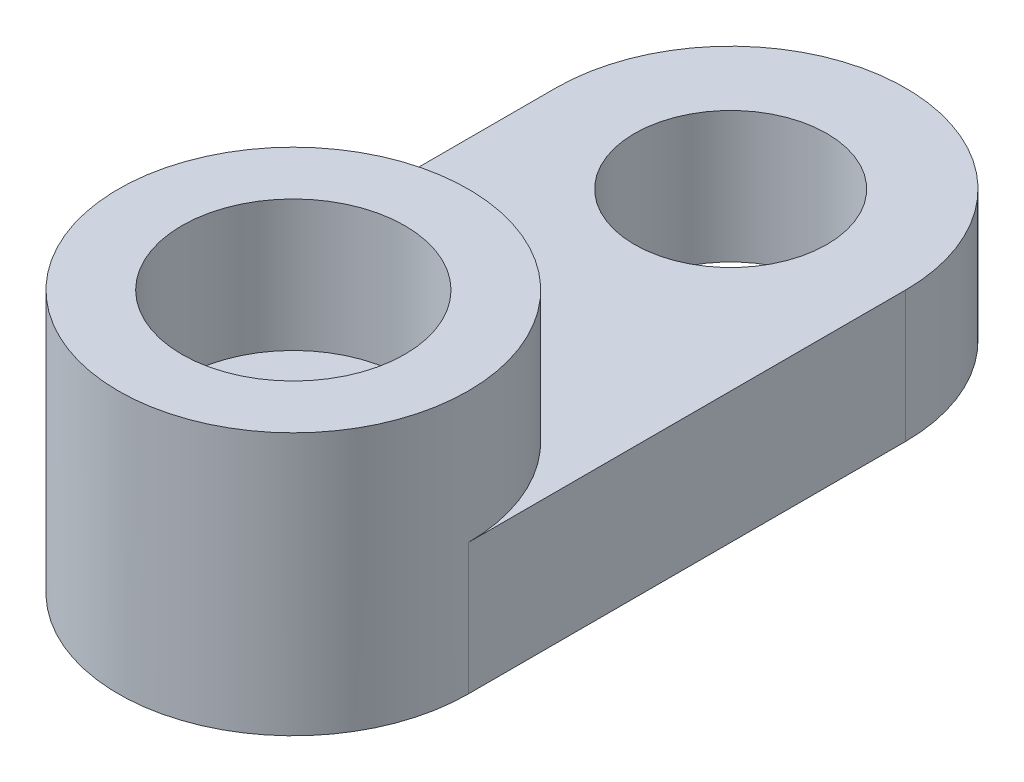
ISO-10303-21;
HEADER;
FILE_DESCRIPTION(('STEP AP214'),'2;1');
FILE_NAME('part.step','',(''),(''),'','','');
FILE_SCHEMA(('AUTOMOTIVE_DESIGN { 1 0 10303 214 1 1 1 1 }'));
ENDSEC;
DATA;
#1=APPLICATION_CONTEXT('core data for automotive mechanical design processes');
#2=APPLICATION_PROTOCOL_DEFINITION('international standard','automotive_design',2000,#1);
#3=PRODUCT_CONTEXT('',#1,'mechanical');
#4=PRODUCT('Part','Part','',(#3));
#5=PRODUCT_RELATED_PRODUCT_CATEGORY('part','',(#4));
#6=PRODUCT_DEFINITION_FORMATION('','',#4);
#7=PRODUCT_DEFINITION_CONTEXT('part definition',#1,'design');
#8=PRODUCT_DEFINITION('design','',#6,#7);
#9=PRODUCT_DEFINITION_SHAPE('','',#8);
#10=(LENGTH_UNIT() NAMED_UNIT(*) SI_UNIT(.MILLI.,.METRE.));
#11=(NAMED_UNIT(*) PLANE_ANGLE_UNIT() SI_UNIT($,.RADIAN.));
#12=(NAMED_UNIT(*) SI_UNIT($,.STERADIAN.) SOLID_ANGLE_UNIT());
#13=UNCERTAINTY_MEASURE_WITH_UNIT(LENGTH_MEASURE(1.E-05),#10,'distance_accuracy_value','');
#14=(GEOMETRIC_REPRESENTATION_CONTEXT(3) GLOBAL_UNCERTAINTY_ASSIGNED_CONTEXT((#13)) GLOBAL_UNIT_ASSIGNED_CONTEXT((#10,
#11,#12)) REPRESENTATION_CONTEXT('',''));
#15=CARTESIAN_POINT('',(0.,0.,0.));
#16=DIRECTION('',(0.,0.,1.));
#17=DIRECTION('',(1.,0.,0.));
#18=AXIS2_PLACEMENT_3D('',#15,#16,#17);
#19=CARTESIAN_POINT('',(0.,3.81,0.));
#20=DIRECTION('',(0.,1.,0.));
#21=DIRECTION('',(0.,0.,1.));
#22=AXIS2_PLACEMENT_3D('',#19,#20,#21);
#23=PLANE('',#22);
#24=CARTESIAN_POINT('',(0.,3.81,0.));
#25=DIRECTION('',(0.,1.,0.));
#26=DIRECTION('',(0.,0.,1.));
#27=AXIS2_PLACEMENT_3D('',#24,#25,#26);
#28=CIRCLE('',#27,1.778);
#29=CARTESIAN_POINT('',(0.,3.81,-1.778));
#30=VERTEX_POINT('',#29);
#31=EDGE_CURVE('E131',#30,#30,#28,.T.);
#32=ORIENTED_EDGE('',*,*,#31,.F.);
#33=EDGE_LOOP('',(#32));
#34=FACE_BOUND('',#33,.T.);
#35=CARTESIAN_POINT('',(0.,3.81,0.));
#36=DIRECTION('',(0.,1.,0.));
#37=DIRECTION('',(0.,0.,1.));
#38=AXIS2_PLACEMENT_3D('',#35,#36,#37);
#39=CIRCLE('',#38,3.2385);
#40=CARTESIAN_POINT('',(0.,3.81,-3.2385));
#41=VERTEX_POINT('',#40);
#42=EDGE_CURVE('E119',#41,#41,#39,.T.);
#43=ORIENTED_EDGE('',*,*,#42,.T.);
#44=EDGE_LOOP('',(#43));
#45=FACE_BOUND('',#44,.T.);
#46=ADVANCED_FACE('F45',(#34,#45),#23,.T.);
#47=CARTESIAN_POINT('',(0.,3.81,0.));
#48=DIRECTION('',(0.,1.,0.));
#49=DIRECTION('',(0.,0.,1.));
#50=AXIS2_PLACEMENT_3D('',#47,#48,#49);
#51=CIRCLE('',#50,5.08);
#52=CARTESIAN_POINT('',(5.08,3.81,0.));
#53=VERTEX_POINT('',#52);
#54=CARTESIAN_POINT('',(-5.08,3.81,0.));
#55=VERTEX_POINT('',#54);
#56=EDGE_CURVE('E98',#53,#55,#51,.T.);
#57=ORIENTED_EDGE('',*,*,#56,.F.);
#58=DIRECTION('',(0.,0.,-1.));
#59=VECTOR('',#58,1.);
#60=CARTESIAN_POINT('',(5.08,3.81,0.));
#61=LINE('',#60,#59);
#62=CARTESIAN_POINT('',(5.08,3.81,-12.7));
#63=VERTEX_POINT('',#62);
#64=EDGE_CURVE('E90',#53,#63,#61,.T.);
#65=ORIENTED_EDGE('',*,*,#64,.T.);
#66=CARTESIAN_POINT('',(0.,3.81,-12.7));
#67=DIRECTION('',(0.,1.,0.));
#68=DIRECTION('',(0.,0.,1.));
#69=AXIS2_PLACEMENT_3D('',#66,#67,#68);
#70=CIRCLE('',#69,5.08);
#71=CARTESIAN_POINT('',(-5.08,3.81,-12.7));
#72=VERTEX_POINT('',#71);
#73=EDGE_CURVE('E105',#63,#72,#70,.T.);
#74=ORIENTED_EDGE('',*,*,#73,.T.);
#75=DIRECTION('',(0.,0.,1.));
#76=VECTOR('',#75,1.);
#77=CARTESIAN_POINT('',(-5.08,3.81,0.));
#78=LINE('',#77,#76);
#79=EDGE_CURVE('E63',#72,#55,#78,.T.);
#80=ORIENTED_EDGE('',*,*,#79,.T.);
#81=EDGE_LOOP('',(#57,#65,#74,#80));
#82=FACE_BOUND('',#81,.T.);
#83=CARTESIAN_POINT('',(0.,3.81,-12.7));
#84=DIRECTION('',(0.,1.,0.));
#85=DIRECTION('',(0.,0.,1.));
#86=AXIS2_PLACEMENT_3D('',#83,#84,#85);
#87=CIRCLE('',#86,2.794);
#88=CARTESIAN_POINT('',(0.,3.81,-15.494));
#89=VERTEX_POINT('',#88);
#90=EDGE_CURVE('E123',#89,#89,#87,.T.);
#91=ORIENTED_EDGE('',*,*,#90,.F.);
#92=EDGE_LOOP('',(#91));
#93=FACE_BOUND('',#92,.T.);
#94=ADVANCED_FACE('F107',(#82,#93),#23,.T.);
#95=CARTESIAN_POINT('',(0.,0.,0.));
#96=DIRECTION('',(0.,1.,0.));
#97=DIRECTION('',(0.,0.,1.));
#98=AXIS2_PLACEMENT_3D('',#95,#96,#97);
#99=PLANE('',#98);
#100=CARTESIAN_POINT('',(0.,0.,0.));
#101=DIRECTION('',(0.,1.,0.));
#102=DIRECTION('',(0.,0.,1.));
#103=AXIS2_PLACEMENT_3D('',#100,#101,#102);
#104=CIRCLE('',#103,5.08);
#105=CARTESIAN_POINT('',(-5.08,0.,0.));
#106=VERTEX_POINT('',#105);
#107=CARTESIAN_POINT('',(5.08,0.,0.));
#108=VERTEX_POINT('',#107);
#109=EDGE_CURVE('E100',#106,#108,#104,.T.);
#110=ORIENTED_EDGE('',*,*,#109,.F.);
#111=DIRECTION('',(0.,0.,1.));
#112=VECTOR('',#111,1.);
#113=CARTESIAN_POINT('',(-5.08,0.,0.));
#114=LINE('',#113,#112);
#115=CARTESIAN_POINT('',(-5.08,0.,-12.7));
#116=VERTEX_POINT('',#115);
#117=EDGE_CURVE('E86',#116,#106,#114,.T.);
#118=ORIENTED_EDGE('',*,*,#117,.F.);
#119=CARTESIAN_POINT('',(0.,0.,-12.7));
#120=DIRECTION('',(0.,1.,0.));
#121=DIRECTION('',(0.,0.,1.));
#122=AXIS2_PLACEMENT_3D('',#119,#120,#121);
#123=CIRCLE('',#122,5.08);
#124=CARTESIAN_POINT('',(5.08,0.,-12.7));
#125=VERTEX_POINT('',#124);
#126=EDGE_CURVE('E81',#125,#116,#123,.T.);
#127=ORIENTED_EDGE('',*,*,#126,.F.);
#128=DIRECTION('',(0.,0.,-1.));
#129=VECTOR('',#128,1.);
#130=CARTESIAN_POINT('',(5.08,0.,0.));
#131=LINE('',#130,#129);
#132=EDGE_CURVE('E145',#108,#125,#131,.T.);
#133=ORIENTED_EDGE('',*,*,#132,.F.);
#134=EDGE_LOOP('',(#110,#118,#127,#133));
#135=FACE_BOUND('',#134,.T.);
#136=CARTESIAN_POINT('',(0.,0.,0.));
#137=DIRECTION('',(0.,1.,0.));
#138=DIRECTION('',(0.,0.,1.));
#139=AXIS2_PLACEMENT_3D('',#136,#137,#138);
#140=CIRCLE('',#139,1.778);
#141=CARTESIAN_POINT('',(0.,0.,-1.778));
#142=VERTEX_POINT('',#141);
#143=EDGE_CURVE('E127',#142,#142,#140,.T.);
#144=ORIENTED_EDGE('',*,*,#143,.T.);
#145=EDGE_LOOP('',(#144));
#146=FACE_BOUND('',#145,.T.);
#147=CARTESIAN_POINT('',(0.,0.,-12.7));
#148=DIRECTION('',(0.,1.,0.));
#149=DIRECTION('',(0.,0.,1.));
#150=AXIS2_PLACEMENT_3D('',#147,#148,#149);
#151=CIRCLE('',#150,2.794);
#152=CARTESIAN_POINT('',(0.,0.,-15.494));
#153=VERTEX_POINT('',#152);
#154=EDGE_CURVE('E116',#153,#153,#151,.T.);
#155=ORIENTED_EDGE('',*,*,#154,.T.);
#156=EDGE_LOOP('',(#155));
#157=FACE_BOUND('',#156,.T.);
#158=ADVANCED_FACE('F159',(#135,#146,#157),#99,.F.);
#159=CARTESIAN_POINT('',(0.,3.81,0.));
#160=DIRECTION('',(0.,-1.,0.));
#161=DIRECTION('',(0.,0.,-1.));
#162=AXIS2_PLACEMENT_3D('',#159,#160,#161);
#163=CYLINDRICAL_SURFACE('',#162,5.08);
#164=ORIENTED_EDGE('',*,*,#109,.T.);
#165=DIRECTION('',(0.,-1.,0.));
#166=VECTOR('',#165,1.);
#167=CARTESIAN_POINT('',(5.08,3.81,0.));
#168=LINE('',#167,#166);
#169=EDGE_CURVE('E11',#53,#108,#168,.T.);
#170=ORIENTED_EDGE('',*,*,#169,.F.);
#171=ORIENTED_EDGE('',*,*,#56,.T.);
#172=DIRECTION('',(0.,-1.,0.));
#173=VECTOR('',#172,1.);
#174=CARTESIAN_POINT('',(-5.08,3.81,0.));
#175=LINE('',#174,#173);
#176=EDGE_CURVE('E142',#55,#106,#175,.T.);
#177=ORIENTED_EDGE('',*,*,#176,.T.);
#178=EDGE_LOOP('',(#164,#170,#171,#177));
#179=FACE_BOUND('',#178,.T.);
#180=CARTESIAN_POINT('',(0.,7.62,0.));
#181=DIRECTION('',(0.,1.,0.));
#182=DIRECTION('',(0.,0.,1.));
#183=AXIS2_PLACEMENT_3D('',#180,#181,#182);
#184=CIRCLE('',#183,5.08);
#185=CARTESIAN_POINT('',(0.,7.62,5.08));
#186=VERTEX_POINT('',#185);
#187=EDGE_CURVE('E110',#186,#186,#184,.T.);
#188=ORIENTED_EDGE('',*,*,#187,.F.);
#189=EDGE_LOOP('',(#188));
#190=FACE_BOUND('',#189,.T.);
#191=ADVANCED_FACE('F47',(#179,#190),#163,.T.);
#192=CARTESIAN_POINT('',(5.08,3.81,0.));
#193=DIRECTION('',(-1.,0.,0.));
#194=DIRECTION('',(0.,0.,1.));
#195=AXIS2_PLACEMENT_3D('',#192,#193,#194);
#196=PLANE('',#195);
#197=ORIENTED_EDGE('',*,*,#132,.T.);
#198=DIRECTION('',(0.,-1.,0.));
#199=VECTOR('',#198,1.);
#200=CARTESIAN_POINT('',(5.08,3.81,-12.7));
#201=LINE('',#200,#199);
#202=EDGE_CURVE('E55',#63,#125,#201,.T.);
#203=ORIENTED_EDGE('',*,*,#202,.F.);
#204=ORIENTED_EDGE('',*,*,#64,.F.);
#205=ORIENTED_EDGE('',*,*,#169,.T.);
#206=EDGE_LOOP('',(#197,#203,#204,#205));
#207=FACE_BOUND('',#206,.T.);
#208=ADVANCED_FACE('F102',(#207),#196,.F.);
#209=CARTESIAN_POINT('',(0.,3.81,-12.7));
#210=DIRECTION('',(0.,-1.,0.));
#211=DIRECTION('',(0.,0.,-1.));
#212=AXIS2_PLACEMENT_3D('',#209,#210,#211);
#213=CYLINDRICAL_SURFACE('',#212,5.08);
#214=ORIENTED_EDGE('',*,*,#126,.T.);
#215=DIRECTION('',(0.,-1.,0.));
#216=VECTOR('',#215,1.);
#217=CARTESIAN_POINT('',(-5.08,3.81,-12.7));
#218=LINE('',#217,#216);
#219=EDGE_CURVE('E154',#72,#116,#218,.T.);
#220=ORIENTED_EDGE('',*,*,#219,.F.);
#221=ORIENTED_EDGE('',*,*,#73,.F.);
#222=ORIENTED_EDGE('',*,*,#202,.T.);
#223=EDGE_LOOP('',(#214,#220,#221,#222));
#224=FACE_BOUND('',#223,.T.);
#225=ADVANCED_FACE('F157',(#224),#213,.T.);
#226=CARTESIAN_POINT('',(-5.08,3.81,0.));
#227=DIRECTION('',(1.,0.,0.));
#228=DIRECTION('',(0.,0.,-1.));
#229=AXIS2_PLACEMENT_3D('',#226,#227,#228);
#230=PLANE('',#229);
#231=ORIENTED_EDGE('',*,*,#117,.T.);
#232=ORIENTED_EDGE('',*,*,#176,.F.);
#233=ORIENTED_EDGE('',*,*,#79,.F.);
#234=ORIENTED_EDGE('',*,*,#219,.T.);
#235=EDGE_LOOP('',(#231,#232,#233,#234));
#236=FACE_BOUND('',#235,.T.);
#237=ADVANCED_FACE('F181',(#236),#230,.F.);
#238=CARTESIAN_POINT('',(0.,3.81,0.));
#239=DIRECTION('',(0.,-1.,0.));
#240=DIRECTION('',(0.,0.,-1.));
#241=AXIS2_PLACEMENT_3D('',#238,#239,#240);
#242=CYLINDRICAL_SURFACE('',#241,1.778);
#243=CARTESIAN_POINT('',(0.,3.81,-1.778));
#244=CARTESIAN_POINT('',(0.,3.7703125,-1.778));
#245=CARTESIAN_POINT('',(0.,3.730625,-1.778));
#246=CARTESIAN_POINT('',(0.,3.65125,-1.778));
#247=CARTESIAN_POINT('',(0.,3.6115625,-1.778));
#248=CARTESIAN_POINT('',(0.,3.5321875,-1.778));
#249=CARTESIAN_POINT('',(0.,3.4925,-1.778));
#250=CARTESIAN_POINT('',(0.,3.413125,-1.778));
#251=CARTESIAN_POINT('',(0.,3.3734375,-1.778));
#252=CARTESIAN_POINT('',(0.,3.2940625,-1.778));
#253=CARTESIAN_POINT('',(0.,3.254375,-1.778));
#254=CARTESIAN_POINT('',(0.,3.175,-1.778));
#255=CARTESIAN_POINT('',(0.,3.1353125,-1.778));
#256=CARTESIAN_POINT('',(0.,3.0559375,-1.778));
#257=CARTESIAN_POINT('',(0.,3.01625,-1.778));
#258=CARTESIAN_POINT('',(0.,2.936875,-1.778));
#259=CARTESIAN_POINT('',(0.,2.8971875,-1.778));
#260=CARTESIAN_POINT('',(0.,2.8178125,-1.778));
#261=CARTESIAN_POINT('',(0.,2.778125,-1.778));
#262=CARTESIAN_POINT('',(0.,2.69875,-1.778));
#263=CARTESIAN_POINT('',(0.,2.6590625,-1.778));
#264=CARTESIAN_POINT('',(0.,2.5796875,-1.778));
#265=CARTESIAN_POINT('',(0.,2.54,-1.778));
#266=CARTESIAN_POINT('',(0.,2.460625,-1.778));
#267=CARTESIAN_POINT('',(0.,2.4209375,-1.778));
#268=CARTESIAN_POINT('',(0.,2.3415625,-1.778));
#269=CARTESIAN_POINT('',(0.,2.301875,-1.778));
#270=CARTESIAN_POINT('',(0.,2.2225,-1.778));
#271=CARTESIAN_POINT('',(0.,2.1828125,-1.778));
#272=CARTESIAN_POINT('',(0.,2.1034375,-1.778));
#273=CARTESIAN_POINT('',(0.,2.06375,-1.778));
#274=CARTESIAN_POINT('',(0.,1.984375,-1.778));
#275=CARTESIAN_POINT('',(0.,1.9446875,-1.778));
#276=CARTESIAN_POINT('',(0.,1.8653125,-1.778));
#277=CARTESIAN_POINT('',(0.,1.825625,-1.778));
#278=CARTESIAN_POINT('',(0.,1.74625,-1.778));
#279=CARTESIAN_POINT('',(0.,1.7065625,-1.778));
#280=CARTESIAN_POINT('',(0.,1.6271875,-1.778));
#281=CARTESIAN_POINT('',(0.,1.5875,-1.778));
#282=CARTESIAN_POINT('',(0.,1.508125,-1.778));
#283=CARTESIAN_POINT('',(0.,1.4684375,-1.778));
#284=CARTESIAN_POINT('',(0.,1.3890625,-1.778));
#285=CARTESIAN_POINT('',(0.,1.349375,-1.778));
#286=CARTESIAN_POINT('',(0.,1.27,-1.778));
#287=CARTESIAN_POINT('',(0.,1.2303125,-1.778));
#288=CARTESIAN_POINT('',(0.,1.1509375,-1.778));
#289=CARTESIAN_POINT('',(0.,1.11125,-1.778));
#290=CARTESIAN_POINT('',(0.,1.031875,-1.778));
#291=CARTESIAN_POINT('',(0.,0.9921875,-1.778));
#292=CARTESIAN_POINT('',(0.,0.9128125,-1.778));
#293=CARTESIAN_POINT('',(0.,0.873125,-1.778));
#294=CARTESIAN_POINT('',(0.,0.79375,-1.778));
#295=CARTESIAN_POINT('',(0.,0.7540625,-1.778));
#296=CARTESIAN_POINT('',(0.,0.6746875,-1.778));
#297=CARTESIAN_POINT('',(0.,0.635,-1.778));
#298=CARTESIAN_POINT('',(0.,0.555625,-1.778));
#299=CARTESIAN_POINT('',(0.,0.5159375,-1.778));
#300=CARTESIAN_POINT('',(0.,0.4365625,-1.778));
#301=CARTESIAN_POINT('',(0.,0.396875,-1.778));
#302=CARTESIAN_POINT('',(0.,0.3175,-1.778));
#303=CARTESIAN_POINT('',(0.,0.2778125,-1.778));
#304=CARTESIAN_POINT('',(0.,0.1984375,-1.778));
#305=CARTESIAN_POINT('',(0.,0.15875,-1.778));
#306=CARTESIAN_POINT('',(0.,0.0793749999999999,-1.778));
#307=CARTESIAN_POINT('',(0.,0.0396874999999999,-1.778));
#308=CARTESIAN_POINT('',(0.,0.,-1.778));
#309=B_SPLINE_CURVE_WITH_KNOTS('',3,(#243,#244,#245,#246,#247,#248,#249,#250,#251,#252,#253,
#254,#255,#256,#257,#258,#259,#260,#261,#262,#263,#264,#265,#266,#267,#268,#269,#270,#271,#272,
#273,#274,#275,#276,#277,#278,#279,#280,#281,#282,#283,#284,#285,#286,#287,#288,#289,#290,#291,
#292,#293,#294,#295,#296,#297,#298,#299,#300,#301,#302,#303,#304,#305,#306,#307,#308),
.UNSPECIFIED.,.F.,.F.,(4,2,2,2,2,2,2,2,2,2,2,2,2,2,2,2,2,2,2,2,2,2,2,2,2,2,2,2,2,2,2,2,4),(0.,
0.1190625,0.238125,0.3571875,0.47625,0.5953125,0.714375,0.8334375,0.9525,1.0715625,1.190625,
1.3096875,1.42875,1.5478125,1.666875,1.7859375,1.905,2.0240625,2.143125,2.2621875,2.38125,
2.5003125,2.619375,2.7384375,2.8575,2.9765625,3.095625,3.2146875,3.33375,3.4528125,3.571875,
3.6909375,3.81),.UNSPECIFIED.);
#310=EDGE_CURVE('BSEAM170',#30,#142,#309,.T.);
#311=ORIENTED_EDGE('',*,*,#31,.T.);
#312=ORIENTED_EDGE('',*,*,#143,.F.);
#313=ORIENTED_EDGE('',*,*,#310,.T.);
#314=ORIENTED_EDGE('',*,*,#310,.F.);
#315=EDGE_LOOP('',(#311,#313,#312,#314));
#316=FACE_BOUND('',#315,.T.);
#317=ADVANCED_FACE('F170',(#316),#242,.F.);
#318=CARTESIAN_POINT('',(0.,3.81,-12.7));
#319=DIRECTION('',(0.,-1.,0.));
#320=DIRECTION('',(0.,0.,-1.));
#321=AXIS2_PLACEMENT_3D('',#318,#319,#320);
#322=CYLINDRICAL_SURFACE('',#321,2.794);
#323=CARTESIAN_POINT('',(0.,3.81,-15.494));
#324=CARTESIAN_POINT('',(0.,3.7703125,-15.494));
#325=CARTESIAN_POINT('',(0.,3.730625,-15.494));
#326=CARTESIAN_POINT('',(0.,3.65125,-15.494));
#327=CARTESIAN_POINT('',(0.,3.6115625,-15.494));
#328=CARTESIAN_POINT('',(0.,3.5321875,-15.494));
#329=CARTESIAN_POINT('',(0.,3.4925,-15.494));
#330=CARTESIAN_POINT('',(0.,3.413125,-15.494));
#331=CARTESIAN_POINT('',(0.,3.3734375,-15.494));
#332=CARTESIAN_POINT('',(0.,3.2940625,-15.494));
#333=CARTESIAN_POINT('',(0.,3.254375,-15.494));
#334=CARTESIAN_POINT('',(0.,3.175,-15.494));
#335=CARTESIAN_POINT('',(0.,3.1353125,-15.494));
#336=CARTESIAN_POINT('',(0.,3.0559375,-15.494));
#337=CARTESIAN_POINT('',(0.,3.01625,-15.494));
#338=CARTESIAN_POINT('',(0.,2.936875,-15.494));
#339=CARTESIAN_POINT('',(0.,2.8971875,-15.494));
#340=CARTESIAN_POINT('',(0.,2.8178125,-15.494));
#341=CARTESIAN_POINT('',(0.,2.778125,-15.494));
#342=CARTESIAN_POINT('',(0.,2.69875,-15.494));
#343=CARTESIAN_POINT('',(0.,2.6590625,-15.494));
#344=CARTESIAN_POINT('',(0.,2.5796875,-15.494));
#345=CARTESIAN_POINT('',(0.,2.54,-15.494));
#346=CARTESIAN_POINT('',(0.,2.460625,-15.494));
#347=CARTESIAN_POINT('',(0.,2.4209375,-15.494));
#348=CARTESIAN_POINT('',(0.,2.3415625,-15.494));
#349=CARTESIAN_POINT('',(0.,2.301875,-15.494));
#350=CARTESIAN_POINT('',(0.,2.2225,-15.494));
#351=CARTESIAN_POINT('',(0.,2.1828125,-15.494));
#352=CARTESIAN_POINT('',(0.,2.1034375,-15.494));
#353=CARTESIAN_POINT('',(0.,2.06375,-15.494));
#354=CARTESIAN_POINT('',(0.,1.984375,-15.494));
#355=CARTESIAN_POINT('',(0.,1.9446875,-15.494));
#356=CARTESIAN_POINT('',(0.,1.8653125,-15.494));
#357=CARTESIAN_POINT('',(0.,1.825625,-15.494));
#358=CARTESIAN_POINT('',(0.,1.74625,-15.494));
#359=CARTESIAN_POINT('',(0.,1.7065625,-15.494));
#360=CARTESIAN_POINT('',(0.,1.6271875,-15.494));
#361=CARTESIAN_POINT('',(0.,1.5875,-15.494));
#362=CARTESIAN_POINT('',(0.,1.508125,-15.494));
#363=CARTESIAN_POINT('',(0.,1.4684375,-15.494));
#364=CARTESIAN_POINT('',(0.,1.3890625,-15.494));
#365=CARTESIAN_POINT('',(0.,1.349375,-15.494));
#366=CARTESIAN_POINT('',(0.,1.27,-15.494));
#367=CARTESIAN_POINT('',(0.,1.2303125,-15.494));
#368=CARTESIAN_POINT('',(0.,1.1509375,-15.494));
#369=CARTESIAN_POINT('',(0.,1.11125,-15.494));
#370=CARTESIAN_POINT('',(0.,1.031875,-15.494));
#371=CARTESIAN_POINT('',(0.,0.9921875,-15.494));
#372=CARTESIAN_POINT('',(0.,0.9128125,-15.494));
#373=CARTESIAN_POINT('',(0.,0.873125,-15.494));
#374=CARTESIAN_POINT('',(0.,0.79375,-15.494));
#375=CARTESIAN_POINT('',(0.,0.7540625,-15.494));
#376=CARTESIAN_POINT('',(0.,0.6746875,-15.494));
#377=CARTESIAN_POINT('',(0.,0.635,-15.494));
#378=CARTESIAN_POINT('',(0.,0.555625,-15.494));
#379=CARTESIAN_POINT('',(0.,0.5159375,-15.494));
#380=CARTESIAN_POINT('',(0.,0.4365625,-15.494));
#381=CARTESIAN_POINT('',(0.,0.396875,-15.494));
#382=CARTESIAN_POINT('',(0.,0.3175,-15.494));
#383=CARTESIAN_POINT('',(0.,0.2778125,-15.494));
#384=CARTESIAN_POINT('',(0.,0.1984375,-15.494));
#385=CARTESIAN_POINT('',(0.,0.15875,-15.494));
#386=CARTESIAN_POINT('',(0.,0.0793749999999999,-15.494));
#387=CARTESIAN_POINT('',(0.,0.0396874999999999,-15.494));
#388=CARTESIAN_POINT('',(0.,0.,-15.494));
#389=B_SPLINE_CURVE_WITH_KNOTS('',3,(#323,#324,#325,#326,#327,#328,#329,#330,#331,#332,#333,
#334,#335,#336,#337,#338,#339,#340,#341,#342,#343,#344,#345,#346,#347,#348,#349,#350,#351,#352,
#353,#354,#355,#356,#357,#358,#359,#360,#361,#362,#363,#364,#365,#366,#367,#368,#369,#370,#371,
#372,#373,#374,#375,#376,#377,#378,#379,#380,#381,#382,#383,#384,#385,#386,#387,#388),
.UNSPECIFIED.,.F.,.F.,(4,2,2,2,2,2,2,2,2,2,2,2,2,2,2,2,2,2,2,2,2,2,2,2,2,2,2,2,2,2,2,2,4),(0.,
0.1190625,0.238125,0.3571875,0.47625,0.5953125,0.714375,0.8334375,0.9525,1.0715625,1.190625,
1.3096875,1.42875,1.5478125,1.666875,1.7859375,1.905,2.0240625,2.143125,2.2621875,2.38125,
2.5003125,2.619375,2.7384375,2.8575,2.9765625,3.095625,3.2146875,3.33375,3.4528125,3.571875,
3.6909375,3.81),.UNSPECIFIED.);
#390=EDGE_CURVE('BSEAM167',#89,#153,#389,.T.);
#391=ORIENTED_EDGE('',*,*,#90,.T.);
#392=ORIENTED_EDGE('',*,*,#154,.F.);
#393=ORIENTED_EDGE('',*,*,#390,.T.);
#394=ORIENTED_EDGE('',*,*,#390,.F.);
#395=EDGE_LOOP('',(#391,#393,#392,#394));
#396=FACE_BOUND('',#395,.T.);
#397=ADVANCED_FACE('F167',(#396),#322,.F.);
#398=CARTESIAN_POINT('',(0.,7.62,0.));
#399=DIRECTION('',(0.,1.,0.));
#400=DIRECTION('',(0.,0.,1.));
#401=AXIS2_PLACEMENT_3D('',#398,#399,#400);
#402=PLANE('',#401);
#403=ORIENTED_EDGE('',*,*,#187,.T.);
#404=EDGE_LOOP('',(#403));
#405=FACE_BOUND('',#404,.T.);
#406=CARTESIAN_POINT('',(0.,7.62,0.));
#407=DIRECTION('',(0.,1.,0.));
#408=DIRECTION('',(0.,0.,1.));
#409=AXIS2_PLACEMENT_3D('',#406,#407,#408);
#410=CIRCLE('',#409,3.2385);
#411=CARTESIAN_POINT('',(0.,7.62,-3.2385));
#412=VERTEX_POINT('',#411);
#413=EDGE_CURVE('E111',#412,#412,#410,.T.);
#414=ORIENTED_EDGE('',*,*,#413,.F.);
#415=EDGE_LOOP('',(#414));
#416=FACE_BOUND('',#415,.T.);
#417=ADVANCED_FACE('F169',(#405,#416),#402,.T.);
#418=CARTESIAN_POINT('',(0.,7.62,0.));
#419=DIRECTION('',(0.,-1.,0.));
#420=DIRECTION('',(0.,0.,-1.));
#421=AXIS2_PLACEMENT_3D('',#418,#419,#420);
#422=CYLINDRICAL_SURFACE('',#421,3.2385);
#423=CARTESIAN_POINT('',(0.,7.62,-3.2385));
#424=CARTESIAN_POINT('',(0.,7.5803125,-3.2385));
#425=CARTESIAN_POINT('',(0.,7.540625,-3.2385));
#426=CARTESIAN_POINT('',(0.,7.46125,-3.2385));
#427=CARTESIAN_POINT('',(0.,7.4215625,-3.2385));
#428=CARTESIAN_POINT('',(0.,7.3421875,-3.2385));
#429=CARTESIAN_POINT('',(0.,7.3025,-3.2385));
#430=CARTESIAN_POINT('',(0.,7.223125,-3.2385));
#431=CARTESIAN_POINT('',(0.,7.1834375,-3.2385));
#432=CARTESIAN_POINT('',(0.,7.1040625,-3.2385));
#433=CARTESIAN_POINT('',(0.,7.064375,-3.2385));
#434=CARTESIAN_POINT('',(0.,6.985,-3.2385));
#435=CARTESIAN_POINT('',(0.,6.9453125,-3.2385));
#436=CARTESIAN_POINT('',(0.,6.8659375,-3.2385));
#437=CARTESIAN_POINT('',(0.,6.82625,-3.2385));
#438=CARTESIAN_POINT('',(0.,6.746875,-3.2385));
#439=CARTESIAN_POINT('',(0.,6.7071875,-3.2385));
#440=CARTESIAN_POINT('',(0.,6.6278125,-3.2385));
#441=CARTESIAN_POINT('',(0.,6.588125,-3.2385));
#442=CARTESIAN_POINT('',(0.,6.50875,-3.2385));
#443=CARTESIAN_POINT('',(0.,6.4690625,-3.2385));
#444=CARTESIAN_POINT('',(0.,6.3896875,-3.2385));
#445=CARTESIAN_POINT('',(0.,6.35,-3.2385));
#446=CARTESIAN_POINT('',(0.,6.270625,-3.2385));
#447=CARTESIAN_POINT('',(0.,6.2309375,-3.2385));
#448=CARTESIAN_POINT('',(0.,6.1515625,-3.2385));
#449=CARTESIAN_POINT('',(0.,6.111875,-3.2385));
#450=CARTESIAN_POINT('',(0.,6.0325,-3.2385));
#451=CARTESIAN_POINT('',(0.,5.9928125,-3.2385));
#452=CARTESIAN_POINT('',(0.,5.9134375,-3.2385));
#453=CARTESIAN_POINT('',(0.,5.87375,-3.2385));
#454=CARTESIAN_POINT('',(0.,5.794375,-3.2385));
#455=CARTESIAN_POINT('',(0.,5.7546875,-3.2385));
#456=CARTESIAN_POINT('',(0.,5.6753125,-3.2385));
#457=CARTESIAN_POINT('',(0.,5.635625,-3.2385));
#458=CARTESIAN_POINT('',(0.,5.55625,-3.2385));
#459=CARTESIAN_POINT('',(0.,5.5165625,-3.2385));
#460=CARTESIAN_POINT('',(0.,5.4371875,-3.2385));
#461=CARTESIAN_POINT('',(0.,5.3975,-3.2385));
#462=CARTESIAN_POINT('',(0.,5.318125,-3.2385));
#463=CARTESIAN_POINT('',(0.,5.2784375,-3.2385));
#464=CARTESIAN_POINT('',(0.,5.1990625,-3.2385));
#465=CARTESIAN_POINT('',(0.,5.159375,-3.2385));
#466=CARTESIAN_POINT('',(0.,5.08,-3.2385));
#467=CARTESIAN_POINT('',(0.,5.0403125,-3.2385));
#468=CARTESIAN_POINT('',(0.,4.9609375,-3.2385));
#469=CARTESIAN_POINT('',(0.,4.92125,-3.2385));
#470=CARTESIAN_POINT('',(0.,4.841875,-3.2385));
#471=CARTESIAN_POINT('',(0.,4.8021875,-3.2385));
#472=CARTESIAN_POINT('',(0.,4.7228125,-3.2385));
#473=CARTESIAN_POINT('',(0.,4.683125,-3.2385));
#474=CARTESIAN_POINT('',(0.,4.60375,-3.2385));
#475=CARTESIAN_POINT('',(0.,4.5640625,-3.2385));
#476=CARTESIAN_POINT('',(0.,4.4846875,-3.2385));
#477=CARTESIAN_POINT('',(0.,4.445,-3.2385));
#478=CARTESIAN_POINT('',(0.,4.365625,-3.2385));
#479=CARTESIAN_POINT('',(0.,4.3259375,-3.2385));
#480=CARTESIAN_POINT('',(0.,4.2465625,-3.2385));
#481=CARTESIAN_POINT('',(0.,4.206875,-3.2385));
#482=CARTESIAN_POINT('',(0.,4.1275,-3.2385));
#483=CARTESIAN_POINT('',(0.,4.0878125,-3.2385));
#484=CARTESIAN_POINT('',(0.,4.0084375,-3.2385));
#485=CARTESIAN_POINT('',(0.,3.96875,-3.2385));
#486=CARTESIAN_POINT('',(0.,3.889375,-3.2385));
#487=CARTESIAN_POINT('',(0.,3.8496875,-3.2385));
#488=CARTESIAN_POINT('',(0.,3.81,-3.2385));
#489=B_SPLINE_CURVE_WITH_KNOTS('',3,(#423,#424,#425,#426,#427,#428,#429,#430,#431,#432,#433,
#434,#435,#436,#437,#438,#439,#440,#441,#442,#443,#444,#445,#446,#447,#448,#449,#450,#451,#452,
#453,#454,#455,#456,#457,#458,#459,#460,#461,#462,#463,#464,#465,#466,#467,#468,#469,#470,#471,
#472,#473,#474,#475,#476,#477,#478,#479,#480,#481,#482,#483,#484,#485,#486,#487,#488),
.UNSPECIFIED.,.F.,.F.,(4,2,2,2,2,2,2,2,2,2,2,2,2,2,2,2,2,2,2,2,2,2,2,2,2,2,2,2,2,2,2,2,4),(0.,
0.119062499999999,0.238125,0.3571875,0.476249999999999,0.595312499999999,0.714375,
0.833437499999999,0.952499999999999,1.0715625,1.190625,1.3096875,1.42875,1.5478125,1.666875,
1.7859375,1.905,2.0240625,2.143125,2.2621875,2.38125,2.5003125,2.619375,2.7384375,2.8575,
2.9765625,3.095625,3.2146875,3.33375,3.4528125,3.571875,3.6909375,3.81),.UNSPECIFIED.);
#490=EDGE_CURVE('BSEAM178',#412,#41,#489,.T.);
#491=ORIENTED_EDGE('',*,*,#413,.T.);
#492=ORIENTED_EDGE('',*,*,#42,.F.);
#493=ORIENTED_EDGE('',*,*,#490,.T.);
#494=ORIENTED_EDGE('',*,*,#490,.F.);
#495=EDGE_LOOP('',(#491,#493,#492,#494));
#496=FACE_BOUND('',#495,.T.);
#497=ADVANCED_FACE('F178',(#496),#422,.F.);
#498=CLOSED_SHELL('',(#46,#94,#158,#191,#208,#225,#237,#317,#397,#417,#497));
#499=MANIFOLD_SOLID_BREP('B2',#498);
#500=ADVANCED_BREP_SHAPE_REPRESENTATION('',(#18,#499),#14);
#501=SHAPE_DEFINITION_REPRESENTATION(#9,#500);
ENDSEC;
END-ISO-10303-21;
